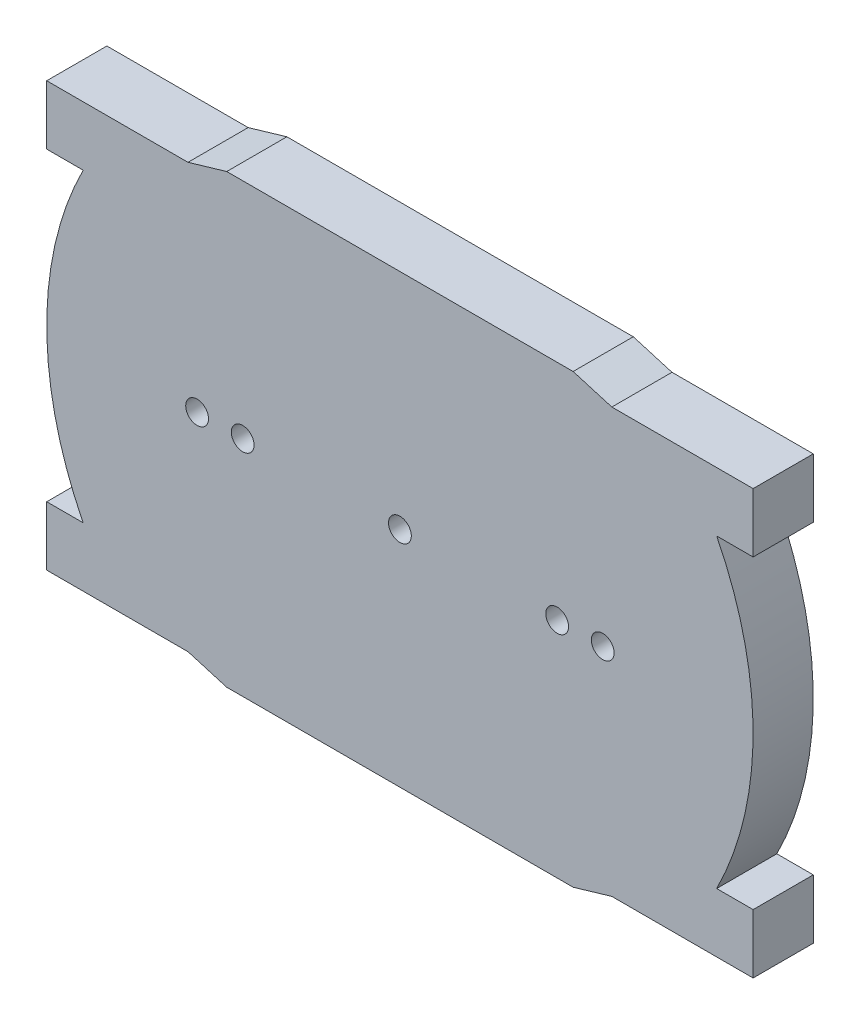
ISO-10303-21;
HEADER;
FILE_DESCRIPTION(('STEP AP214'),'2;1');
FILE_NAME('part.step','',(''),(''),'','','');
FILE_SCHEMA(('AUTOMOTIVE_DESIGN { 1 0 10303 214 1 1 1 1 }'));
ENDSEC;
DATA;
#1=APPLICATION_CONTEXT('core data for automotive mechanical design processes');
#2=APPLICATION_PROTOCOL_DEFINITION('international standard','automotive_design',2000,#1);
#3=PRODUCT_CONTEXT('',#1,'mechanical');
#4=PRODUCT('Part','Part','',(#3));
#5=PRODUCT_RELATED_PRODUCT_CATEGORY('part','',(#4));
#6=PRODUCT_DEFINITION_FORMATION('','',#4);
#7=PRODUCT_DEFINITION_CONTEXT('part definition',#1,'design');
#8=PRODUCT_DEFINITION('design','',#6,#7);
#9=PRODUCT_DEFINITION_SHAPE('','',#8);
#10=(LENGTH_UNIT() NAMED_UNIT(*) SI_UNIT(.MILLI.,.METRE.));
#11=(NAMED_UNIT(*) PLANE_ANGLE_UNIT() SI_UNIT($,.RADIAN.));
#12=(NAMED_UNIT(*) SI_UNIT($,.STERADIAN.) SOLID_ANGLE_UNIT());
#13=UNCERTAINTY_MEASURE_WITH_UNIT(LENGTH_MEASURE(1.E-05),#10,'distance_accuracy_value','');
#14=(GEOMETRIC_REPRESENTATION_CONTEXT(3) GLOBAL_UNCERTAINTY_ASSIGNED_CONTEXT((#13)) GLOBAL_UNIT_ASSIGNED_CONTEXT((#10,
#11,#12)) REPRESENTATION_CONTEXT('',''));
#15=CARTESIAN_POINT('',(0.,0.,0.));
#16=DIRECTION('',(0.,0.,1.));
#17=DIRECTION('',(1.,0.,0.));
#18=AXIS2_PLACEMENT_3D('',#15,#16,#17);
#19=CARTESIAN_POINT('',(77.5,49.,13.2));
#20=DIRECTION('',(-1.,0.,0.));
#21=DIRECTION('',(0.,0.,1.));
#22=AXIS2_PLACEMENT_3D('',#19,#20,#21);
#23=PLANE('',#22);
#24=DIRECTION('',(0.,1.,0.));
#25=VECTOR('',#24,1.);
#26=CARTESIAN_POINT('',(77.5,49.,13.2));
#27=LINE('',#26,#25);
#28=CARTESIAN_POINT('',(77.5,33.5,13.2));
#29=VERTEX_POINT('',#28);
#30=CARTESIAN_POINT('',(77.5,46.5,13.2));
#31=VERTEX_POINT('',#30);
#32=EDGE_CURVE('E317',#29,#31,#27,.T.);
#33=ORIENTED_EDGE('',*,*,#32,.F.);
#34=DIRECTION('',(0.,0.,1.));
#35=VECTOR('',#34,1.);
#36=CARTESIAN_POINT('',(77.5,33.5,0.));
#37=LINE('',#36,#35);
#38=CARTESIAN_POINT('',(77.5,33.5,0.));
#39=VERTEX_POINT('',#38);
#40=EDGE_CURVE('E208',#39,#29,#37,.T.);
#41=ORIENTED_EDGE('',*,*,#40,.F.);
#42=DIRECTION('',(0.,1.,0.));
#43=VECTOR('',#42,1.);
#44=CARTESIAN_POINT('',(77.5,49.,0.));
#45=LINE('',#44,#43);
#46=CARTESIAN_POINT('',(77.5,46.5,0.));
#47=VERTEX_POINT('',#46);
#48=EDGE_CURVE('E324',#39,#47,#45,.T.);
#49=ORIENTED_EDGE('',*,*,#48,.T.);
#50=DIRECTION('',(0.,0.,1.));
#51=VECTOR('',#50,1.);
#52=CARTESIAN_POINT('',(77.5,46.5,0.));
#53=LINE('',#52,#51);
#54=EDGE_CURVE('E285',#47,#31,#53,.T.);
#55=ORIENTED_EDGE('',*,*,#54,.T.);
#56=EDGE_LOOP('',(#33,#41,#49,#55));
#57=FACE_BOUND('',#56,.T.);
#58=ADVANCED_FACE('F35',(#57),#23,.F.);
#59=CARTESIAN_POINT('',(-77.5,49.,13.2));
#60=DIRECTION('',(1.,0.,0.));
#61=DIRECTION('',(0.,0.,-1.));
#62=AXIS2_PLACEMENT_3D('',#59,#60,#61);
#63=PLANE('',#62);
#64=DIRECTION('',(0.,-1.,0.));
#65=VECTOR('',#64,1.);
#66=CARTESIAN_POINT('',(-77.5,49.,0.));
#67=LINE('',#66,#65);
#68=CARTESIAN_POINT('',(-77.5,46.5,0.));
#69=VERTEX_POINT('',#68);
#70=CARTESIAN_POINT('',(-77.5,33.5,0.));
#71=VERTEX_POINT('',#70);
#72=EDGE_CURVE('E320',#69,#71,#67,.T.);
#73=ORIENTED_EDGE('',*,*,#72,.T.);
#74=DIRECTION('',(0.,0.,1.));
#75=VECTOR('',#74,1.);
#76=CARTESIAN_POINT('',(-77.5,33.5,0.));
#77=LINE('',#76,#75);
#78=CARTESIAN_POINT('',(-77.5,33.5,13.2));
#79=VERTEX_POINT('',#78);
#80=EDGE_CURVE('E226',#71,#79,#77,.T.);
#81=ORIENTED_EDGE('',*,*,#80,.T.);
#82=DIRECTION('',(0.,-1.,0.));
#83=VECTOR('',#82,1.);
#84=CARTESIAN_POINT('',(-77.5,49.,13.2));
#85=LINE('',#84,#83);
#86=CARTESIAN_POINT('',(-77.5,46.5,13.2));
#87=VERTEX_POINT('',#86);
#88=EDGE_CURVE('E311',#87,#79,#85,.T.);
#89=ORIENTED_EDGE('',*,*,#88,.F.);
#90=DIRECTION('',(0.,0.,1.));
#91=VECTOR('',#90,1.);
#92=CARTESIAN_POINT('',(-77.5,46.5,0.));
#93=LINE('',#92,#91);
#94=EDGE_CURVE('E299',#69,#87,#93,.T.);
#95=ORIENTED_EDGE('',*,*,#94,.F.);
#96=EDGE_LOOP('',(#73,#81,#89,#95));
#97=FACE_BOUND('',#96,.T.);
#98=ADVANCED_FACE('F359',(#97),#63,.F.);
#99=CARTESIAN_POINT('',(-77.5,-33.5,13.2));
#100=VERTEX_POINT('',#99);
#101=CARTESIAN_POINT('',(-77.5,-46.5,13.2));
#102=VERTEX_POINT('',#101);
#103=EDGE_CURVE('E315',#100,#102,#85,.T.);
#104=ORIENTED_EDGE('',*,*,#103,.F.);
#105=DIRECTION('',(0.,0.,1.));
#106=VECTOR('',#105,1.);
#107=CARTESIAN_POINT('',(-77.5,-33.5,0.));
#108=LINE('',#107,#106);
#109=CARTESIAN_POINT('',(-77.5,-33.5,0.));
#110=VERTEX_POINT('',#109);
#111=EDGE_CURVE('E219',#110,#100,#108,.T.);
#112=ORIENTED_EDGE('',*,*,#111,.F.);
#113=CARTESIAN_POINT('',(-77.5,-46.5,0.));
#114=VERTEX_POINT('',#113);
#115=EDGE_CURVE('E307',#110,#114,#67,.T.);
#116=ORIENTED_EDGE('',*,*,#115,.T.);
#117=DIRECTION('',(0.,0.,1.));
#118=VECTOR('',#117,1.);
#119=CARTESIAN_POINT('',(-77.5,-46.5,0.));
#120=LINE('',#119,#118);
#121=EDGE_CURVE('E247',#114,#102,#120,.T.);
#122=ORIENTED_EDGE('',*,*,#121,.T.);
#123=EDGE_LOOP('',(#104,#112,#116,#122));
#124=FACE_BOUND('',#123,.T.);
#125=ADVANCED_FACE('F37',(#124),#63,.F.);
#126=CARTESIAN_POINT('',(-77.5,-49.,13.2));
#127=DIRECTION('',(0.,1.,0.));
#128=DIRECTION('',(-1.,0.,0.));
#129=AXIS2_PLACEMENT_3D('',#126,#127,#128);
#130=PLANE('',#129);
#131=DIRECTION('',(1.,0.,0.));
#132=VECTOR('',#131,1.);
#133=CARTESIAN_POINT('',(-77.5,-49.,13.2));
#134=LINE('',#133,#132);
#135=CARTESIAN_POINT('',(-38.,-49.,13.2));
#136=VERTEX_POINT('',#135);
#137=CARTESIAN_POINT('',(38.,-49.,13.2));
#138=VERTEX_POINT('',#137);
#139=EDGE_CURVE('E314',#136,#138,#134,.T.);
#140=ORIENTED_EDGE('',*,*,#139,.F.);
#141=DIRECTION('',(0.,0.,1.));
#142=VECTOR('',#141,1.);
#143=CARTESIAN_POINT('',(-38.,-49.,0.));
#144=LINE('',#143,#142);
#145=CARTESIAN_POINT('',(-38.,-49.,0.));
#146=VERTEX_POINT('',#145);
#147=EDGE_CURVE('E242',#146,#136,#144,.T.);
#148=ORIENTED_EDGE('',*,*,#147,.F.);
#149=DIRECTION('',(1.,0.,0.));
#150=VECTOR('',#149,1.);
#151=CARTESIAN_POINT('',(-77.5,-49.,0.));
#152=LINE('',#151,#150);
#153=CARTESIAN_POINT('',(38.,-49.,0.));
#154=VERTEX_POINT('',#153);
#155=EDGE_CURVE('E323',#146,#154,#152,.T.);
#156=ORIENTED_EDGE('',*,*,#155,.T.);
#157=DIRECTION('',(0.,0.,1.));
#158=VECTOR('',#157,1.);
#159=CARTESIAN_POINT('',(38.,-49.,0.));
#160=LINE('',#159,#158);
#161=EDGE_CURVE('E266',#154,#138,#160,.T.);
#162=ORIENTED_EDGE('',*,*,#161,.T.);
#163=EDGE_LOOP('',(#140,#148,#156,#162));
#164=FACE_BOUND('',#163,.T.);
#165=ADVANCED_FACE('F384',(#164),#130,.F.);
#166=CARTESIAN_POINT('',(77.5,-46.5,0.));
#167=VERTEX_POINT('',#166);
#168=CARTESIAN_POINT('',(77.5,-33.5,0.));
#169=VERTEX_POINT('',#168);
#170=EDGE_CURVE('E325',#167,#169,#45,.T.);
#171=ORIENTED_EDGE('',*,*,#170,.T.);
#172=DIRECTION('',(0.,0.,1.));
#173=VECTOR('',#172,1.);
#174=CARTESIAN_POINT('',(77.5,-33.5,0.));
#175=LINE('',#174,#173);
#176=CARTESIAN_POINT('',(77.5,-33.5,13.2));
#177=VERTEX_POINT('',#176);
#178=EDGE_CURVE('E52',#169,#177,#175,.T.);
#179=ORIENTED_EDGE('',*,*,#178,.T.);
#180=CARTESIAN_POINT('',(77.5,-46.5,13.2));
#181=VERTEX_POINT('',#180);
#182=EDGE_CURVE('E44',#181,#177,#27,.T.);
#183=ORIENTED_EDGE('',*,*,#182,.F.);
#184=DIRECTION('',(0.,0.,1.));
#185=VECTOR('',#184,1.);
#186=CARTESIAN_POINT('',(77.5,-46.5,0.));
#187=LINE('',#186,#185);
#188=EDGE_CURVE('E261',#167,#181,#187,.T.);
#189=ORIENTED_EDGE('',*,*,#188,.F.);
#190=EDGE_LOOP('',(#171,#179,#183,#189));
#191=FACE_BOUND('',#190,.T.);
#192=ADVANCED_FACE('F394',(#191),#23,.F.);
#193=CARTESIAN_POINT('',(-77.5,49.,13.2));
#194=DIRECTION('',(0.,-1.,0.));
#195=DIRECTION('',(1.,0.,0.));
#196=AXIS2_PLACEMENT_3D('',#193,#194,#195);
#197=PLANE('',#196);
#198=DIRECTION('',(-1.,0.,0.));
#199=VECTOR('',#198,1.);
#200=CARTESIAN_POINT('',(-77.5,49.,13.2));
#201=LINE('',#200,#199);
#202=CARTESIAN_POINT('',(38.,49.,13.2));
#203=VERTEX_POINT('',#202);
#204=CARTESIAN_POINT('',(-38.,49.,13.2));
#205=VERTEX_POINT('',#204);
#206=EDGE_CURVE('E11',#203,#205,#201,.T.);
#207=ORIENTED_EDGE('',*,*,#206,.F.);
#208=DIRECTION('',(0.,0.,1.));
#209=VECTOR('',#208,1.);
#210=CARTESIAN_POINT('',(38.,49.,0.));
#211=LINE('',#210,#209);
#212=CARTESIAN_POINT('',(38.,49.,0.));
#213=VERTEX_POINT('',#212);
#214=EDGE_CURVE('E280',#213,#203,#211,.T.);
#215=ORIENTED_EDGE('',*,*,#214,.F.);
#216=DIRECTION('',(-1.,0.,0.));
#217=VECTOR('',#216,1.);
#218=CARTESIAN_POINT('',(-77.5,49.,0.));
#219=LINE('',#218,#217);
#220=CARTESIAN_POINT('',(-38.,49.,0.));
#221=VERTEX_POINT('',#220);
#222=EDGE_CURVE('E39',#213,#221,#219,.T.);
#223=ORIENTED_EDGE('',*,*,#222,.T.);
#224=DIRECTION('',(0.,0.,1.));
#225=VECTOR('',#224,1.);
#226=CARTESIAN_POINT('',(-38.,49.,0.));
#227=LINE('',#226,#225);
#228=EDGE_CURVE('E304',#221,#205,#227,.T.);
#229=ORIENTED_EDGE('',*,*,#228,.T.);
#230=EDGE_LOOP('',(#207,#215,#223,#229));
#231=FACE_BOUND('',#230,.T.);
#232=ADVANCED_FACE('F343',(#231),#197,.F.);
#233=CARTESIAN_POINT('',(0.,0.,13.2));
#234=DIRECTION('',(0.,0.,1.));
#235=DIRECTION('',(1.,0.,0.));
#236=AXIS2_PLACEMENT_3D('',#233,#234,#235);
#237=PLANE('',#236);
#238=CARTESIAN_POINT('',(-44.5,0.,13.2));
#239=DIRECTION('',(0.,0.,-1.));
#240=DIRECTION('',(1.,0.,0.));
#241=AXIS2_PLACEMENT_3D('',#238,#239,#240);
#242=CIRCLE('',#241,2.5);
#243=CARTESIAN_POINT('',(-42.,0.,13.2));
#244=VERTEX_POINT('',#243);
#245=EDGE_CURVE('E531',#244,#244,#242,.T.);
#246=ORIENTED_EDGE('',*,*,#245,.T.);
#247=EDGE_LOOP('',(#246));
#248=FACE_BOUND('',#247,.T.);
#249=CARTESIAN_POINT('',(-34.5,0.,13.2));
#250=DIRECTION('',(0.,0.,-1.));
#251=DIRECTION('',(1.,0.,0.));
#252=AXIS2_PLACEMENT_3D('',#249,#250,#251);
#253=CIRCLE('',#252,2.49999999999999);
#254=CARTESIAN_POINT('',(-32.,0.,13.2));
#255=VERTEX_POINT('',#254);
#256=EDGE_CURVE('E540',#255,#255,#253,.T.);
#257=ORIENTED_EDGE('',*,*,#256,.T.);
#258=EDGE_LOOP('',(#257));
#259=FACE_BOUND('',#258,.T.);
#260=CARTESIAN_POINT('',(0.,0.,13.2));
#261=DIRECTION('',(0.,0.,-1.));
#262=DIRECTION('',(-1.,0.,0.));
#263=AXIS2_PLACEMENT_3D('',#260,#261,#262);
#264=CIRCLE('',#263,2.5);
#265=CARTESIAN_POINT('',(-2.5,0.,13.2));
#266=VERTEX_POINT('',#265);
#267=EDGE_CURVE('E546',#266,#266,#264,.T.);
#268=ORIENTED_EDGE('',*,*,#267,.T.);
#269=EDGE_LOOP('',(#268));
#270=FACE_BOUND('',#269,.T.);
#271=CARTESIAN_POINT('',(34.5,0.,13.2));
#272=DIRECTION('',(0.,0.,-1.));
#273=DIRECTION('',(-1.,0.,0.));
#274=AXIS2_PLACEMENT_3D('',#271,#272,#273);
#275=CIRCLE('',#274,2.49999999999999);
#276=CARTESIAN_POINT('',(32.,0.,13.2));
#277=VERTEX_POINT('',#276);
#278=EDGE_CURVE('E552',#277,#277,#275,.T.);
#279=ORIENTED_EDGE('',*,*,#278,.T.);
#280=EDGE_LOOP('',(#279));
#281=FACE_BOUND('',#280,.T.);
#282=CARTESIAN_POINT('',(44.5,0.,13.2));
#283=DIRECTION('',(0.,0.,-1.));
#284=DIRECTION('',(-1.,0.,0.));
#285=AXIS2_PLACEMENT_3D('',#282,#283,#284);
#286=CIRCLE('',#285,2.5);
#287=CARTESIAN_POINT('',(42.,0.,13.2));
#288=VERTEX_POINT('',#287);
#289=EDGE_CURVE('E203',#288,#288,#286,.T.);
#290=ORIENTED_EDGE('',*,*,#289,.T.);
#291=EDGE_LOOP('',(#290));
#292=FACE_BOUND('',#291,.T.);
#293=DIRECTION('',(-1.,0.,0.));
#294=VECTOR('',#293,1.);
#295=CARTESIAN_POINT('',(77.5,33.5,13.2));
#296=LINE('',#295,#294);
#297=CARTESIAN_POINT('',(69.5,33.5,13.2));
#298=VERTEX_POINT('',#297);
#299=EDGE_CURVE('E192',#29,#298,#296,.T.);
#300=ORIENTED_EDGE('',*,*,#299,.F.);
#301=ORIENTED_EDGE('',*,*,#32,.T.);
#302=DIRECTION('',(1.,0.,0.));
#303=VECTOR('',#302,1.);
#304=CARTESIAN_POINT('',(46.5,46.5,13.2));
#305=LINE('',#304,#303);
#306=CARTESIAN_POINT('',(46.5,46.5,13.2));
#307=VERTEX_POINT('',#306);
#308=EDGE_CURVE('E277',#307,#31,#305,.T.);
#309=ORIENTED_EDGE('',*,*,#308,.F.);
#310=DIRECTION('',(0.959365501571269,-0.282166323991555,0.));
#311=VECTOR('',#310,1.);
#312=CARTESIAN_POINT('',(38.,49.,13.2));
#313=LINE('',#312,#311);
#314=EDGE_CURVE('E269',#203,#307,#313,.T.);
#315=ORIENTED_EDGE('',*,*,#314,.F.);
#316=ORIENTED_EDGE('',*,*,#206,.T.);
#317=DIRECTION('',(0.959365501571269,0.282166323991554,0.));
#318=VECTOR('',#317,1.);
#319=CARTESIAN_POINT('',(-38.,49.,13.2));
#320=LINE('',#319,#318);
#321=CARTESIAN_POINT('',(-46.5,46.5,13.2));
#322=VERTEX_POINT('',#321);
#323=EDGE_CURVE('E296',#322,#205,#320,.T.);
#324=ORIENTED_EDGE('',*,*,#323,.F.);
#325=DIRECTION('',(1.,0.,0.));
#326=VECTOR('',#325,1.);
#327=CARTESIAN_POINT('',(-46.5,46.5,13.2));
#328=LINE('',#327,#326);
#329=EDGE_CURVE('E288',#87,#322,#328,.T.);
#330=ORIENTED_EDGE('',*,*,#329,.F.);
#331=ORIENTED_EDGE('',*,*,#88,.T.);
#332=DIRECTION('',(-1.,0.,0.));
#333=VECTOR('',#332,1.);
#334=CARTESIAN_POINT('',(-77.5,33.5,13.2));
#335=LINE('',#334,#333);
#336=CARTESIAN_POINT('',(-69.5,33.5,13.2));
#337=VERTEX_POINT('',#336);
#338=EDGE_CURVE('E214',#337,#79,#335,.T.);
#339=ORIENTED_EDGE('',*,*,#338,.F.);
#340=CARTESIAN_POINT('',(-3.26658948685851,0.,13.2));
#341=DIRECTION('',(0.,0.,-1.));
#342=DIRECTION('',(1.,0.,0.));
#343=AXIS2_PLACEMENT_3D('',#340,#341,#342);
#344=CIRCLE('',#343,74.2234105131415);
#345=CARTESIAN_POINT('',(-69.5,-33.5,13.2));
#346=VERTEX_POINT('',#345);
#347=EDGE_CURVE('E222',#346,#337,#344,.T.);
#348=ORIENTED_EDGE('',*,*,#347,.F.);
#349=DIRECTION('',(1.,0.,0.));
#350=VECTOR('',#349,1.);
#351=CARTESIAN_POINT('',(-77.5,-33.5,13.2));
#352=LINE('',#351,#350);
#353=EDGE_CURVE('E207',#100,#346,#352,.T.);
#354=ORIENTED_EDGE('',*,*,#353,.F.);
#355=ORIENTED_EDGE('',*,*,#103,.T.);
#356=DIRECTION('',(-1.,0.,0.));
#357=VECTOR('',#356,1.);
#358=CARTESIAN_POINT('',(-46.5,-46.5,13.2));
#359=LINE('',#358,#357);
#360=CARTESIAN_POINT('',(-46.5,-46.5,13.2));
#361=VERTEX_POINT('',#360);
#362=EDGE_CURVE('E239',#361,#102,#359,.T.);
#363=ORIENTED_EDGE('',*,*,#362,.F.);
#364=DIRECTION('',(-0.959365501571269,0.282166323991555,0.));
#365=VECTOR('',#364,1.);
#366=CARTESIAN_POINT('',(-38.,-49.,13.2));
#367=LINE('',#366,#365);
#368=EDGE_CURVE('E229',#136,#361,#367,.T.);
#369=ORIENTED_EDGE('',*,*,#368,.F.);
#370=ORIENTED_EDGE('',*,*,#139,.T.);
#371=DIRECTION('',(-0.959365501571269,-0.282166323991555,0.));
#372=VECTOR('',#371,1.);
#373=CARTESIAN_POINT('',(38.,-49.,13.2));
#374=LINE('',#373,#372);
#375=CARTESIAN_POINT('',(46.5,-46.5,13.2));
#376=VERTEX_POINT('',#375);
#377=EDGE_CURVE('E258',#376,#138,#374,.T.);
#378=ORIENTED_EDGE('',*,*,#377,.F.);
#379=DIRECTION('',(-1.,0.,0.));
#380=VECTOR('',#379,1.);
#381=CARTESIAN_POINT('',(46.5,-46.5,13.2));
#382=LINE('',#381,#380);
#383=EDGE_CURVE('E250',#181,#376,#382,.T.);
#384=ORIENTED_EDGE('',*,*,#383,.F.);
#385=ORIENTED_EDGE('',*,*,#182,.T.);
#386=DIRECTION('',(1.,0.,0.));
#387=VECTOR('',#386,1.);
#388=CARTESIAN_POINT('',(77.5,-33.5,13.2));
#389=LINE('',#388,#387);
#390=CARTESIAN_POINT('',(69.5,-33.5,13.2));
#391=VERTEX_POINT('',#390);
#392=EDGE_CURVE('E195',#391,#177,#389,.T.);
#393=ORIENTED_EDGE('',*,*,#392,.F.);
#394=CARTESIAN_POINT('',(3.26658948685853,0.,13.2));
#395=DIRECTION('',(0.,0.,-1.));
#396=DIRECTION('',(-1.,0.,0.));
#397=AXIS2_PLACEMENT_3D('',#394,#395,#396);
#398=CIRCLE('',#397,74.2234105131414);
#399=EDGE_CURVE('E180',#298,#391,#398,.T.);
#400=ORIENTED_EDGE('',*,*,#399,.F.);
#401=EDGE_LOOP('',(#300,#301,#309,#315,#316,#324,#330,#331,#339,#348,#354,#355,#363,#369,#370,
#378,#384,#385,#393,#400));
#402=FACE_BOUND('',#401,.T.);
#403=ADVANCED_FACE('F348',(#248,#259,#270,#281,#292,#402),#237,.T.);
#404=CARTESIAN_POINT('',(0.,0.,0.));
#405=DIRECTION('',(0.,0.,1.));
#406=DIRECTION('',(1.,0.,0.));
#407=AXIS2_PLACEMENT_3D('',#404,#405,#406);
#408=PLANE('',#407);
#409=CARTESIAN_POINT('',(-44.5,0.,0.));
#410=DIRECTION('',(0.,0.,-1.));
#411=DIRECTION('',(1.,0.,0.));
#412=AXIS2_PLACEMENT_3D('',#409,#410,#411);
#413=CIRCLE('',#412,2.5);
#414=CARTESIAN_POINT('',(-42.,0.,0.));
#415=VERTEX_POINT('',#414);
#416=EDGE_CURVE('E534',#415,#415,#413,.T.);
#417=ORIENTED_EDGE('',*,*,#416,.F.);
#418=EDGE_LOOP('',(#417));
#419=FACE_BOUND('',#418,.T.);
#420=CARTESIAN_POINT('',(-34.5,0.,0.));
#421=DIRECTION('',(0.,0.,-1.));
#422=DIRECTION('',(1.,0.,0.));
#423=AXIS2_PLACEMENT_3D('',#420,#421,#422);
#424=CIRCLE('',#423,2.49999999999999);
#425=CARTESIAN_POINT('',(-32.,0.,0.));
#426=VERTEX_POINT('',#425);
#427=EDGE_CURVE('E537',#426,#426,#424,.T.);
#428=ORIENTED_EDGE('',*,*,#427,.F.);
#429=EDGE_LOOP('',(#428));
#430=FACE_BOUND('',#429,.T.);
#431=CARTESIAN_POINT('',(0.,0.,0.));
#432=DIRECTION('',(0.,0.,-1.));
#433=DIRECTION('',(-1.,0.,0.));
#434=AXIS2_PLACEMENT_3D('',#431,#432,#433);
#435=CIRCLE('',#434,2.5);
#436=CARTESIAN_POINT('',(-2.5,0.,0.));
#437=VERTEX_POINT('',#436);
#438=EDGE_CURVE('E543',#437,#437,#435,.T.);
#439=ORIENTED_EDGE('',*,*,#438,.F.);
#440=EDGE_LOOP('',(#439));
#441=FACE_BOUND('',#440,.T.);
#442=CARTESIAN_POINT('',(34.5,0.,0.));
#443=DIRECTION('',(0.,0.,-1.));
#444=DIRECTION('',(-1.,0.,0.));
#445=AXIS2_PLACEMENT_3D('',#442,#443,#444);
#446=CIRCLE('',#445,2.49999999999999);
#447=CARTESIAN_POINT('',(32.,0.,0.));
#448=VERTEX_POINT('',#447);
#449=EDGE_CURVE('E549',#448,#448,#446,.T.);
#450=ORIENTED_EDGE('',*,*,#449,.F.);
#451=EDGE_LOOP('',(#450));
#452=FACE_BOUND('',#451,.T.);
#453=CARTESIAN_POINT('',(44.5,0.,0.));
#454=DIRECTION('',(0.,0.,-1.));
#455=DIRECTION('',(-1.,0.,0.));
#456=AXIS2_PLACEMENT_3D('',#453,#454,#455);
#457=CIRCLE('',#456,2.5);
#458=CARTESIAN_POINT('',(42.,0.,0.));
#459=VERTEX_POINT('',#458);
#460=EDGE_CURVE('E198',#459,#459,#457,.T.);
#461=ORIENTED_EDGE('',*,*,#460,.F.);
#462=EDGE_LOOP('',(#461));
#463=FACE_BOUND('',#462,.T.);
#464=ORIENTED_EDGE('',*,*,#48,.F.);
#465=DIRECTION('',(-1.,0.,0.));
#466=VECTOR('',#465,1.);
#467=CARTESIAN_POINT('',(77.5,33.5,0.));
#468=LINE('',#467,#466);
#469=CARTESIAN_POINT('',(69.5,33.5,0.));
#470=VERTEX_POINT('',#469);
#471=EDGE_CURVE('E182',#39,#470,#468,.T.);
#472=ORIENTED_EDGE('',*,*,#471,.T.);
#473=CARTESIAN_POINT('',(3.26658948685853,0.,0.));
#474=DIRECTION('',(0.,0.,-1.));
#475=DIRECTION('',(-1.,0.,0.));
#476=AXIS2_PLACEMENT_3D('',#473,#474,#475);
#477=CIRCLE('',#476,74.2234105131414);
#478=CARTESIAN_POINT('',(69.5,-33.5,0.));
#479=VERTEX_POINT('',#478);
#480=EDGE_CURVE('E177',#470,#479,#477,.T.);
#481=ORIENTED_EDGE('',*,*,#480,.T.);
#482=DIRECTION('',(1.,0.,0.));
#483=VECTOR('',#482,1.);
#484=CARTESIAN_POINT('',(77.5,-33.5,0.));
#485=LINE('',#484,#483);
#486=EDGE_CURVE('E184',#479,#169,#485,.T.);
#487=ORIENTED_EDGE('',*,*,#486,.T.);
#488=ORIENTED_EDGE('',*,*,#170,.F.);
#489=DIRECTION('',(-1.,0.,0.));
#490=VECTOR('',#489,1.);
#491=CARTESIAN_POINT('',(46.5,-46.5,0.));
#492=LINE('',#491,#490);
#493=CARTESIAN_POINT('',(46.5,-46.5,0.));
#494=VERTEX_POINT('',#493);
#495=EDGE_CURVE('E254',#167,#494,#492,.T.);
#496=ORIENTED_EDGE('',*,*,#495,.T.);
#497=DIRECTION('',(-0.959365501571269,-0.282166323991555,0.));
#498=VECTOR('',#497,1.);
#499=CARTESIAN_POINT('',(38.,-49.,0.));
#500=LINE('',#499,#498);
#501=EDGE_CURVE('E257',#494,#154,#500,.T.);
#502=ORIENTED_EDGE('',*,*,#501,.T.);
#503=ORIENTED_EDGE('',*,*,#155,.F.);
#504=DIRECTION('',(-0.959365501571269,0.282166323991555,0.));
#505=VECTOR('',#504,1.);
#506=CARTESIAN_POINT('',(-38.,-49.,0.));
#507=LINE('',#506,#505);
#508=CARTESIAN_POINT('',(-46.5,-46.5,0.));
#509=VERTEX_POINT('',#508);
#510=EDGE_CURVE('E235',#146,#509,#507,.T.);
#511=ORIENTED_EDGE('',*,*,#510,.T.);
#512=DIRECTION('',(-1.,0.,0.));
#513=VECTOR('',#512,1.);
#514=CARTESIAN_POINT('',(-46.5,-46.5,0.));
#515=LINE('',#514,#513);
#516=EDGE_CURVE('E238',#509,#114,#515,.T.);
#517=ORIENTED_EDGE('',*,*,#516,.T.);
#518=ORIENTED_EDGE('',*,*,#115,.F.);
#519=DIRECTION('',(1.,0.,0.));
#520=VECTOR('',#519,1.);
#521=CARTESIAN_POINT('',(-77.5,-33.5,0.));
#522=LINE('',#521,#520);
#523=CARTESIAN_POINT('',(-69.5,-33.5,0.));
#524=VERTEX_POINT('',#523);
#525=EDGE_CURVE('E211',#110,#524,#522,.T.);
#526=ORIENTED_EDGE('',*,*,#525,.T.);
#527=CARTESIAN_POINT('',(-3.26658948685851,0.,0.));
#528=DIRECTION('',(0.,0.,-1.));
#529=DIRECTION('',(1.,0.,0.));
#530=AXIS2_PLACEMENT_3D('',#527,#528,#529);
#531=CIRCLE('',#530,74.2234105131415);
#532=CARTESIAN_POINT('',(-69.5,33.5,0.));
#533=VERTEX_POINT('',#532);
#534=EDGE_CURVE('E60',#524,#533,#531,.T.);
#535=ORIENTED_EDGE('',*,*,#534,.T.);
#536=DIRECTION('',(-1.,0.,0.));
#537=VECTOR('',#536,1.);
#538=CARTESIAN_POINT('',(-77.5,33.5,0.));
#539=LINE('',#538,#537);
#540=EDGE_CURVE('E216',#533,#71,#539,.T.);
#541=ORIENTED_EDGE('',*,*,#540,.T.);
#542=ORIENTED_EDGE('',*,*,#72,.F.);
#543=DIRECTION('',(1.,0.,0.));
#544=VECTOR('',#543,1.);
#545=CARTESIAN_POINT('',(-46.5,46.5,0.));
#546=LINE('',#545,#544);
#547=CARTESIAN_POINT('',(-46.5,46.5,0.));
#548=VERTEX_POINT('',#547);
#549=EDGE_CURVE('E292',#69,#548,#546,.T.);
#550=ORIENTED_EDGE('',*,*,#549,.T.);
#551=DIRECTION('',(0.959365501571269,0.282166323991554,0.));
#552=VECTOR('',#551,1.);
#553=CARTESIAN_POINT('',(-38.,49.,0.));
#554=LINE('',#553,#552);
#555=EDGE_CURVE('E295',#548,#221,#554,.T.);
#556=ORIENTED_EDGE('',*,*,#555,.T.);
#557=ORIENTED_EDGE('',*,*,#222,.F.);
#558=DIRECTION('',(0.959365501571269,-0.282166323991555,0.));
#559=VECTOR('',#558,1.);
#560=CARTESIAN_POINT('',(38.,49.,0.));
#561=LINE('',#560,#559);
#562=CARTESIAN_POINT('',(46.5,46.5,0.));
#563=VERTEX_POINT('',#562);
#564=EDGE_CURVE('E273',#213,#563,#561,.T.);
#565=ORIENTED_EDGE('',*,*,#564,.T.);
#566=DIRECTION('',(1.,0.,0.));
#567=VECTOR('',#566,1.);
#568=CARTESIAN_POINT('',(46.5,46.5,0.));
#569=LINE('',#568,#567);
#570=EDGE_CURVE('E276',#563,#47,#569,.T.);
#571=ORIENTED_EDGE('',*,*,#570,.T.);
#572=EDGE_LOOP('',(#464,#472,#481,#487,#488,#496,#502,#503,#511,#517,#518,#526,#535,#541,#542,
#550,#556,#557,#565,#571));
#573=FACE_BOUND('',#572,.T.);
#574=ADVANCED_FACE('F191',(#419,#430,#441,#452,#463,#573),#408,.F.);
#575=CARTESIAN_POINT('',(-38.,49.,0.));
#576=DIRECTION('',(0.282166323991554,-0.959365501571269,0.));
#577=DIRECTION('',(0.959365501571269,0.282166323991554,0.));
#578=AXIS2_PLACEMENT_3D('',#575,#576,#577);
#579=PLANE('',#578);
#580=ORIENTED_EDGE('',*,*,#323,.T.);
#581=ORIENTED_EDGE('',*,*,#228,.F.);
#582=ORIENTED_EDGE('',*,*,#555,.F.);
#583=DIRECTION('',(0.,0.,1.));
#584=VECTOR('',#583,1.);
#585=CARTESIAN_POINT('',(-46.5,46.5,0.));
#586=LINE('',#585,#584);
#587=EDGE_CURVE('E308',#548,#322,#586,.T.);
#588=ORIENTED_EDGE('',*,*,#587,.T.);
#589=EDGE_LOOP('',(#580,#581,#582,#588));
#590=FACE_BOUND('',#589,.T.);
#591=ADVANCED_FACE('F351',(#590),#579,.F.);
#592=CARTESIAN_POINT('',(-46.5,46.5,0.));
#593=DIRECTION('',(0.,-1.,0.));
#594=DIRECTION('',(1.,0.,0.));
#595=AXIS2_PLACEMENT_3D('',#592,#593,#594);
#596=PLANE('',#595);
#597=ORIENTED_EDGE('',*,*,#329,.T.);
#598=ORIENTED_EDGE('',*,*,#587,.F.);
#599=ORIENTED_EDGE('',*,*,#549,.F.);
#600=ORIENTED_EDGE('',*,*,#94,.T.);
#601=EDGE_LOOP('',(#597,#598,#599,#600));
#602=FACE_BOUND('',#601,.T.);
#603=ADVANCED_FACE('F354',(#602),#596,.F.);
#604=CARTESIAN_POINT('',(46.5,46.5,0.));
#605=DIRECTION('',(0.,-1.,0.));
#606=DIRECTION('',(1.,0.,0.));
#607=AXIS2_PLACEMENT_3D('',#604,#605,#606);
#608=PLANE('',#607);
#609=ORIENTED_EDGE('',*,*,#308,.T.);
#610=ORIENTED_EDGE('',*,*,#54,.F.);
#611=ORIENTED_EDGE('',*,*,#570,.F.);
#612=DIRECTION('',(0.,0.,1.));
#613=VECTOR('',#612,1.);
#614=CARTESIAN_POINT('',(46.5,46.5,0.));
#615=LINE('',#614,#613);
#616=EDGE_CURVE('E289',#563,#307,#615,.T.);
#617=ORIENTED_EDGE('',*,*,#616,.T.);
#618=EDGE_LOOP('',(#609,#610,#611,#617));
#619=FACE_BOUND('',#618,.T.);
#620=ADVANCED_FACE('F333',(#619),#608,.F.);
#621=CARTESIAN_POINT('',(38.,49.,0.));
#622=DIRECTION('',(-0.282166323991555,-0.959365501571269,0.));
#623=DIRECTION('',(0.959365501571269,-0.282166323991555,0.));
#624=AXIS2_PLACEMENT_3D('',#621,#622,#623);
#625=PLANE('',#624);
#626=ORIENTED_EDGE('',*,*,#314,.T.);
#627=ORIENTED_EDGE('',*,*,#616,.F.);
#628=ORIENTED_EDGE('',*,*,#564,.F.);
#629=ORIENTED_EDGE('',*,*,#214,.T.);
#630=EDGE_LOOP('',(#626,#627,#628,#629));
#631=FACE_BOUND('',#630,.T.);
#632=ADVANCED_FACE('F339',(#631),#625,.F.);
#633=CARTESIAN_POINT('',(38.,-49.,0.));
#634=DIRECTION('',(-0.282166323991555,0.959365501571269,0.));
#635=DIRECTION('',(-0.959365501571269,-0.282166323991555,0.));
#636=AXIS2_PLACEMENT_3D('',#633,#634,#635);
#637=PLANE('',#636);
#638=ORIENTED_EDGE('',*,*,#377,.T.);
#639=ORIENTED_EDGE('',*,*,#161,.F.);
#640=ORIENTED_EDGE('',*,*,#501,.F.);
#641=DIRECTION('',(0.,0.,1.));
#642=VECTOR('',#641,1.);
#643=CARTESIAN_POINT('',(46.5,-46.5,0.));
#644=LINE('',#643,#642);
#645=EDGE_CURVE('E270',#494,#376,#644,.T.);
#646=ORIENTED_EDGE('',*,*,#645,.T.);
#647=EDGE_LOOP('',(#638,#639,#640,#646));
#648=FACE_BOUND('',#647,.T.);
#649=ADVANCED_FACE('F388',(#648),#637,.F.);
#650=CARTESIAN_POINT('',(46.5,-46.5,0.));
#651=DIRECTION('',(0.,1.,0.));
#652=DIRECTION('',(-1.,0.,0.));
#653=AXIS2_PLACEMENT_3D('',#650,#651,#652);
#654=PLANE('',#653);
#655=ORIENTED_EDGE('',*,*,#383,.T.);
#656=ORIENTED_EDGE('',*,*,#645,.F.);
#657=ORIENTED_EDGE('',*,*,#495,.F.);
#658=ORIENTED_EDGE('',*,*,#188,.T.);
#659=EDGE_LOOP('',(#655,#656,#657,#658));
#660=FACE_BOUND('',#659,.T.);
#661=ADVANCED_FACE('F391',(#660),#654,.F.);
#662=CARTESIAN_POINT('',(-46.5,-46.5,0.));
#663=DIRECTION('',(0.,1.,0.));
#664=DIRECTION('',(-1.,0.,0.));
#665=AXIS2_PLACEMENT_3D('',#662,#663,#664);
#666=PLANE('',#665);
#667=ORIENTED_EDGE('',*,*,#362,.T.);
#668=ORIENTED_EDGE('',*,*,#121,.F.);
#669=ORIENTED_EDGE('',*,*,#516,.F.);
#670=DIRECTION('',(0.,0.,1.));
#671=VECTOR('',#670,1.);
#672=CARTESIAN_POINT('',(-46.5,-46.5,0.));
#673=LINE('',#672,#671);
#674=EDGE_CURVE('E251',#509,#361,#673,.T.);
#675=ORIENTED_EDGE('',*,*,#674,.T.);
#676=EDGE_LOOP('',(#667,#668,#669,#675));
#677=FACE_BOUND('',#676,.T.);
#678=ADVANCED_FACE('F376',(#677),#666,.F.);
#679=CARTESIAN_POINT('',(-38.,-49.,0.));
#680=DIRECTION('',(0.282166323991555,0.959365501571269,0.));
#681=DIRECTION('',(-0.959365501571269,0.282166323991555,0.));
#682=AXIS2_PLACEMENT_3D('',#679,#680,#681);
#683=PLANE('',#682);
#684=ORIENTED_EDGE('',*,*,#368,.T.);
#685=ORIENTED_EDGE('',*,*,#674,.F.);
#686=ORIENTED_EDGE('',*,*,#510,.F.);
#687=ORIENTED_EDGE('',*,*,#147,.T.);
#688=EDGE_LOOP('',(#684,#685,#686,#687));
#689=FACE_BOUND('',#688,.T.);
#690=ADVANCED_FACE('F379',(#689),#683,.F.);
#691=CARTESIAN_POINT('',(-77.5,33.5,0.));
#692=DIRECTION('',(0.,1.,0.));
#693=DIRECTION('',(0.,0.,1.));
#694=AXIS2_PLACEMENT_3D('',#691,#692,#693);
#695=PLANE('',#694);
#696=ORIENTED_EDGE('',*,*,#338,.T.);
#697=ORIENTED_EDGE('',*,*,#80,.F.);
#698=ORIENTED_EDGE('',*,*,#540,.F.);
#699=DIRECTION('',(0.,0.,1.));
#700=VECTOR('',#699,1.);
#701=CARTESIAN_POINT('',(-69.5,33.5,0.));
#702=LINE('',#701,#700);
#703=EDGE_CURVE('E230',#533,#337,#702,.T.);
#704=ORIENTED_EDGE('',*,*,#703,.T.);
#705=EDGE_LOOP('',(#696,#697,#698,#704));
#706=FACE_BOUND('',#705,.T.);
#707=ADVANCED_FACE('F363',(#706),#695,.F.);
#708=CARTESIAN_POINT('',(-3.26658948685851,0.,0.));
#709=DIRECTION('',(0.,0.,1.));
#710=DIRECTION('',(1.,0.,0.));
#711=AXIS2_PLACEMENT_3D('',#708,#709,#710);
#712=CYLINDRICAL_SURFACE('',#711,74.2234105131415);
#713=ORIENTED_EDGE('',*,*,#347,.T.);
#714=ORIENTED_EDGE('',*,*,#703,.F.);
#715=ORIENTED_EDGE('',*,*,#534,.F.);
#716=DIRECTION('',(0.,0.,1.));
#717=VECTOR('',#716,1.);
#718=CARTESIAN_POINT('',(-69.5,-33.5,0.));
#719=LINE('',#718,#717);
#720=EDGE_CURVE('E232',#524,#346,#719,.T.);
#721=ORIENTED_EDGE('',*,*,#720,.T.);
#722=EDGE_LOOP('',(#713,#714,#715,#721));
#723=FACE_BOUND('',#722,.T.);
#724=ADVANCED_FACE('F447',(#723),#712,.T.);
#725=CARTESIAN_POINT('',(-77.5,-33.5,0.));
#726=DIRECTION('',(0.,-1.,0.));
#727=DIRECTION('',(0.,0.,-1.));
#728=AXIS2_PLACEMENT_3D('',#725,#726,#727);
#729=PLANE('',#728);
#730=ORIENTED_EDGE('',*,*,#353,.T.);
#731=ORIENTED_EDGE('',*,*,#720,.F.);
#732=ORIENTED_EDGE('',*,*,#525,.F.);
#733=ORIENTED_EDGE('',*,*,#111,.T.);
#734=EDGE_LOOP('',(#730,#731,#732,#733));
#735=FACE_BOUND('',#734,.T.);
#736=ADVANCED_FACE('F367',(#735),#729,.F.);
#737=CARTESIAN_POINT('',(3.26658948685853,0.,0.));
#738=DIRECTION('',(0.,0.,1.));
#739=DIRECTION('',(1.,0.,0.));
#740=AXIS2_PLACEMENT_3D('',#737,#738,#739);
#741=CYLINDRICAL_SURFACE('',#740,74.2234105131414);
#742=ORIENTED_EDGE('',*,*,#399,.T.);
#743=DIRECTION('',(0.,0.,1.));
#744=VECTOR('',#743,1.);
#745=CARTESIAN_POINT('',(69.5,-33.5,0.));
#746=LINE('',#745,#744);
#747=EDGE_CURVE('E174',#479,#391,#746,.T.);
#748=ORIENTED_EDGE('',*,*,#747,.F.);
#749=ORIENTED_EDGE('',*,*,#480,.F.);
#750=DIRECTION('',(0.,0.,1.));
#751=VECTOR('',#750,1.);
#752=CARTESIAN_POINT('',(69.5,33.5,0.));
#753=LINE('',#752,#751);
#754=EDGE_CURVE('E205',#470,#298,#753,.T.);
#755=ORIENTED_EDGE('',*,*,#754,.T.);
#756=EDGE_LOOP('',(#742,#748,#749,#755));
#757=FACE_BOUND('',#756,.T.);
#758=ADVANCED_FACE('F175',(#757),#741,.T.);
#759=CARTESIAN_POINT('',(77.5,33.5,0.));
#760=DIRECTION('',(0.,1.,0.));
#761=DIRECTION('',(0.,0.,1.));
#762=AXIS2_PLACEMENT_3D('',#759,#760,#761);
#763=PLANE('',#762);
#764=ORIENTED_EDGE('',*,*,#299,.T.);
#765=ORIENTED_EDGE('',*,*,#754,.F.);
#766=ORIENTED_EDGE('',*,*,#471,.F.);
#767=ORIENTED_EDGE('',*,*,#40,.T.);
#768=EDGE_LOOP('',(#764,#765,#766,#767));
#769=FACE_BOUND('',#768,.T.);
#770=ADVANCED_FACE('F396',(#769),#763,.F.);
#771=CARTESIAN_POINT('',(77.5,-33.5,0.));
#772=DIRECTION('',(0.,-1.,0.));
#773=DIRECTION('',(0.,0.,-1.));
#774=AXIS2_PLACEMENT_3D('',#771,#772,#773);
#775=PLANE('',#774);
#776=ORIENTED_EDGE('',*,*,#392,.T.);
#777=ORIENTED_EDGE('',*,*,#178,.F.);
#778=ORIENTED_EDGE('',*,*,#486,.F.);
#779=ORIENTED_EDGE('',*,*,#747,.T.);
#780=EDGE_LOOP('',(#776,#777,#778,#779));
#781=FACE_BOUND('',#780,.T.);
#782=ADVANCED_FACE('F185',(#781),#775,.F.);
#783=CARTESIAN_POINT('',(44.5,0.,13.2));
#784=DIRECTION('',(0.,0.,-1.));
#785=DIRECTION('',(-1.,0.,0.));
#786=AXIS2_PLACEMENT_3D('',#783,#784,#785);
#787=CYLINDRICAL_SURFACE('',#786,2.5);
#788=ORIENTED_EDGE('',*,*,#289,.F.);
#789=EDGE_LOOP('',(#788));
#790=FACE_BOUND('',#789,.T.);
#791=ORIENTED_EDGE('',*,*,#460,.T.);
#792=EDGE_LOOP('',(#791));
#793=FACE_BOUND('',#792,.T.);
#794=ADVANCED_FACE('F403',(#790,#793),#787,.F.);
#795=CARTESIAN_POINT('',(34.5,0.,13.2));
#796=DIRECTION('',(0.,0.,-1.));
#797=DIRECTION('',(-1.,0.,0.));
#798=AXIS2_PLACEMENT_3D('',#795,#796,#797);
#799=CYLINDRICAL_SURFACE('',#798,2.49999999999999);
#800=ORIENTED_EDGE('',*,*,#278,.F.);
#801=EDGE_LOOP('',(#800));
#802=FACE_BOUND('',#801,.T.);
#803=ORIENTED_EDGE('',*,*,#449,.T.);
#804=EDGE_LOOP('',(#803));
#805=FACE_BOUND('',#804,.T.);
#806=ADVANCED_FACE('F484',(#802,#805),#799,.F.);
#807=CARTESIAN_POINT('',(0.,0.,13.2));
#808=DIRECTION('',(0.,0.,-1.));
#809=DIRECTION('',(-1.,0.,0.));
#810=AXIS2_PLACEMENT_3D('',#807,#808,#809);
#811=CYLINDRICAL_SURFACE('',#810,2.5);
#812=ORIENTED_EDGE('',*,*,#267,.F.);
#813=EDGE_LOOP('',(#812));
#814=FACE_BOUND('',#813,.T.);
#815=ORIENTED_EDGE('',*,*,#438,.T.);
#816=EDGE_LOOP('',(#815));
#817=FACE_BOUND('',#816,.T.);
#818=ADVANCED_FACE('F493',(#814,#817),#811,.F.);
#819=CARTESIAN_POINT('',(-34.5,0.,13.2));
#820=DIRECTION('',(0.,0.,-1.));
#821=DIRECTION('',(-1.,0.,0.));
#822=AXIS2_PLACEMENT_3D('',#819,#820,#821);
#823=CYLINDRICAL_SURFACE('',#822,2.49999999999999);
#824=ORIENTED_EDGE('',*,*,#256,.F.);
#825=EDGE_LOOP('',(#824));
#826=FACE_BOUND('',#825,.T.);
#827=ORIENTED_EDGE('',*,*,#427,.T.);
#828=EDGE_LOOP('',(#827));
#829=FACE_BOUND('',#828,.T.);
#830=ADVANCED_FACE('F502',(#826,#829),#823,.F.);
#831=CARTESIAN_POINT('',(-44.5,0.,13.2));
#832=DIRECTION('',(0.,0.,-1.));
#833=DIRECTION('',(-1.,0.,0.));
#834=AXIS2_PLACEMENT_3D('',#831,#832,#833);
#835=CYLINDRICAL_SURFACE('',#834,2.5);
#836=ORIENTED_EDGE('',*,*,#245,.F.);
#837=EDGE_LOOP('',(#836));
#838=FACE_BOUND('',#837,.T.);
#839=ORIENTED_EDGE('',*,*,#416,.T.);
#840=EDGE_LOOP('',(#839));
#841=FACE_BOUND('',#840,.T.);
#842=ADVANCED_FACE('F511',(#838,#841),#835,.F.);
#843=CLOSED_SHELL('',(#58,#98,#125,#165,#192,#232,#403,#574,#591,#603,#620,#632,#649,#661,#678,
#690,#707,#724,#736,#758,#770,#782,#794,#806,#818,#830,#842));
#844=MANIFOLD_SOLID_BREP('B2',#843);
#845=ADVANCED_BREP_SHAPE_REPRESENTATION('',(#18,#844),#14);
#846=SHAPE_DEFINITION_REPRESENTATION(#9,#845);
ENDSEC;
END-ISO-10303-21;
